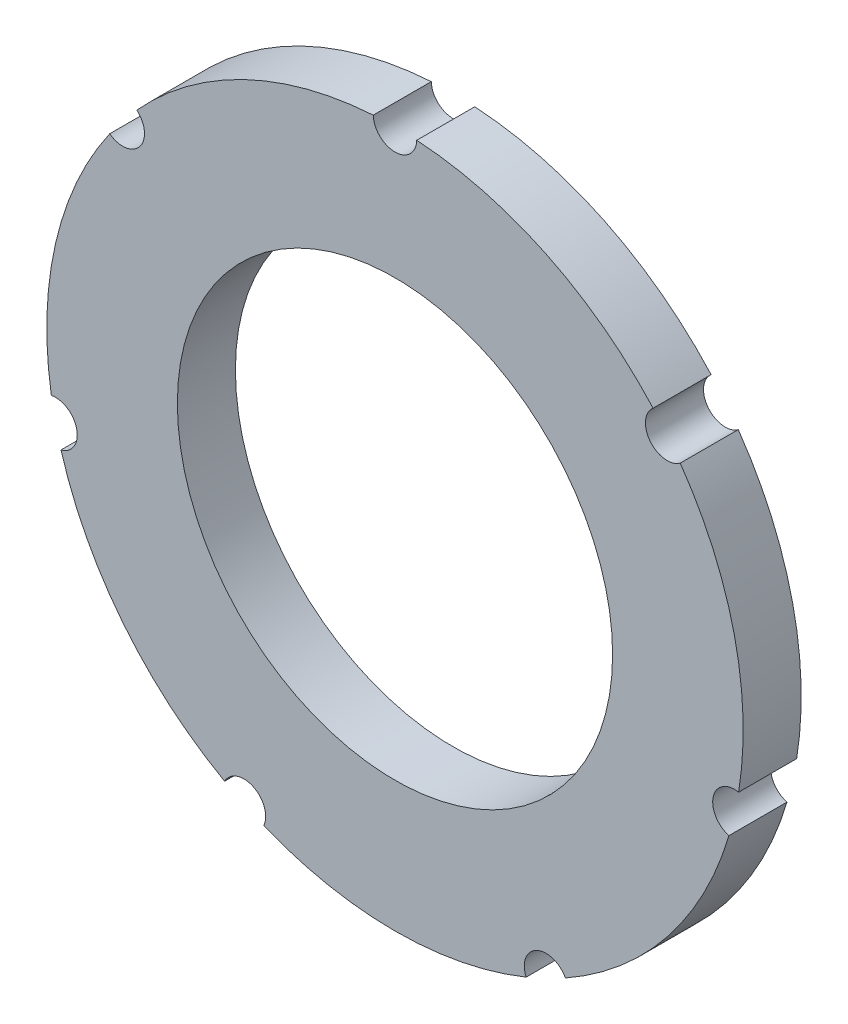
ISO-10303-21;
HEADER;
FILE_DESCRIPTION(('STEP AP214'),'2;1');
FILE_NAME('part.step','',(''),(''),'','','');
FILE_SCHEMA(('AUTOMOTIVE_DESIGN { 1 0 10303 214 1 1 1 1 }'));
ENDSEC;
DATA;
#1=APPLICATION_CONTEXT('core data for automotive mechanical design processes');
#2=APPLICATION_PROTOCOL_DEFINITION('international standard','automotive_design',2000,#1);
#3=PRODUCT_CONTEXT('',#1,'mechanical');
#4=PRODUCT('Part','Part','',(#3));
#5=PRODUCT_RELATED_PRODUCT_CATEGORY('part','',(#4));
#6=PRODUCT_DEFINITION_FORMATION('','',#4);
#7=PRODUCT_DEFINITION_CONTEXT('part definition',#1,'design');
#8=PRODUCT_DEFINITION('design','',#6,#7);
#9=PRODUCT_DEFINITION_SHAPE('','',#8);
#10=(LENGTH_UNIT() NAMED_UNIT(*) SI_UNIT(.MILLI.,.METRE.));
#11=(NAMED_UNIT(*) PLANE_ANGLE_UNIT() SI_UNIT($,.RADIAN.));
#12=(NAMED_UNIT(*) SI_UNIT($,.STERADIAN.) SOLID_ANGLE_UNIT());
#13=UNCERTAINTY_MEASURE_WITH_UNIT(LENGTH_MEASURE(1.E-05),#10,'distance_accuracy_value','');
#14=(GEOMETRIC_REPRESENTATION_CONTEXT(3) GLOBAL_UNCERTAINTY_ASSIGNED_CONTEXT((#13)) GLOBAL_UNIT_ASSIGNED_CONTEXT((#10,
#11,#12)) REPRESENTATION_CONTEXT('',''));
#15=CARTESIAN_POINT('',(0.,0.,0.));
#16=DIRECTION('',(0.,0.,1.));
#17=DIRECTION('',(1.,0.,0.));
#18=AXIS2_PLACEMENT_3D('',#15,#16,#17);
#19=CARTESIAN_POINT('',(0.,12.,4.));
#20=DIRECTION('',(0.,0.,1.));
#21=DIRECTION('',(1.,0.,0.));
#22=AXIS2_PLACEMENT_3D('',#19,#20,#21);
#23=PLANE('',#22);
#24=CARTESIAN_POINT('',(0.,0.,4.));
#25=DIRECTION('',(0.,0.,1.));
#26=DIRECTION('',(1.,0.,0.));
#27=AXIS2_PLACEMENT_3D('',#24,#25,#26);
#28=CIRCLE('',#27,24.);
#29=CARTESIAN_POINT('',(17.7925292948168,16.1067036134985,4.));
#30=VERTEX_POINT('',#29);
#31=CARTESIAN_POINT('',(1.4992673992237,23.953125,4.));
#32=VERTEX_POINT('',#31);
#33=EDGE_CURVE('E197',#30,#32,#28,.T.);
#34=ORIENTED_EDGE('',*,*,#33,.T.);
#35=CARTESIAN_POINT('',(0.,24.,4.));
#36=DIRECTION('',(0.,0.,-1.));
#37=DIRECTION('',(1.,0.,0.));
#38=AXIS2_PLACEMENT_3D('',#35,#36,#37);
#39=CIRCLE('',#38,1.5);
#40=CARTESIAN_POINT('',(-1.4992673992237,23.953125,4.));
#41=VERTEX_POINT('',#40);
#42=EDGE_CURVE('E115',#32,#41,#39,.T.);
#43=ORIENTED_EDGE('',*,*,#42,.T.);
#44=CARTESIAN_POINT('',(0.,0.,4.));
#45=DIRECTION('',(0.,0.,1.));
#46=DIRECTION('',(1.,0.,0.));
#47=AXIS2_PLACEMENT_3D('',#44,#45,#46);
#48=CIRCLE('',#47,24.);
#49=CARTESIAN_POINT('',(-17.7925292948168,16.1067036134985,4.));
#50=VERTEX_POINT('',#49);
#51=EDGE_CURVE('E230',#41,#50,#48,.T.);
#52=ORIENTED_EDGE('',*,*,#51,.T.);
#53=CARTESIAN_POINT('',(-18.7639555792327,14.9637552446096,4.));
#54=DIRECTION('',(0.,0.,-1.));
#55=DIRECTION('',(1.,0.,0.));
#56=AXIS2_PLACEMENT_3D('',#53,#54,#55);
#57=CIRCLE('',#56,1.5);
#58=CARTESIAN_POINT('',(-19.6620851621673,13.7623547067964,4.));
#59=VERTEX_POINT('',#58);
#60=EDGE_CURVE('E249',#50,#59,#57,.T.);
#61=ORIENTED_EDGE('',*,*,#60,.T.);
#62=CARTESIAN_POINT('',(0.,0.,4.));
#63=DIRECTION('',(0.,0.,1.));
#64=DIRECTION('',(1.,0.,0.));
#65=AXIS2_PLACEMENT_3D('',#62,#63,#64);
#66=CIRCLE('',#65,24.);
#67=CARTESIAN_POINT('',(-23.6861885284058,-3.8683941108449,4.));
#68=VERTEX_POINT('',#67);
#69=EDGE_CURVE('E246',#59,#68,#66,.T.);
#70=ORIENTED_EDGE('',*,*,#69,.T.);
#71=CARTESIAN_POINT('',(-23.3982698923638,-5.34050241495155,4.));
#72=DIRECTION('',(0.,0.,-1.));
#73=DIRECTION('',(1.,0.,0.));
#74=AXIS2_PLACEMENT_3D('',#71,#72,#73);
#75=CIRCLE('',#74,1.5);
#76=CARTESIAN_POINT('',(-23.0189517645547,-6.79174938149978,4.));
#77=VERTEX_POINT('',#76);
#78=EDGE_CURVE('E248',#68,#77,#75,.T.);
#79=ORIENTED_EDGE('',*,*,#78,.T.);
#80=CARTESIAN_POINT('',(0.,0.,4.));
#81=DIRECTION('',(0.,0.,1.));
#82=DIRECTION('',(1.,0.,0.));
#83=AXIS2_PLACEMENT_3D('',#80,#81,#82);
#84=CIRCLE('',#83,24.);
#85=CARTESIAN_POINT('',(-11.7436646899119,-20.9305121688629,4.));
#86=VERTEX_POINT('',#85);
#87=EDGE_CURVE('E251',#77,#86,#84,.T.);
#88=ORIENTED_EDGE('',*,*,#87,.T.);
#89=CARTESIAN_POINT('',(-10.4132097388214,-21.6232528296581,4.));
#90=DIRECTION('',(0.,0.,-1.));
#91=DIRECTION('',(1.,0.,0.));
#92=AXIS2_PLACEMENT_3D('',#89,#90,#91);
#93=CIRCLE('',#92,1.5);
#94=CARTESIAN_POINT('',(-9.04207818718867,-22.2315276590874,4.));
#95=VERTEX_POINT('',#94);
#96=EDGE_CURVE('E257',#86,#95,#93,.T.);
#97=ORIENTED_EDGE('',*,*,#96,.T.);
#98=CARTESIAN_POINT('',(0.,0.,4.));
#99=DIRECTION('',(0.,0.,1.));
#100=DIRECTION('',(1.,0.,0.));
#101=AXIS2_PLACEMENT_3D('',#98,#99,#100);
#102=CIRCLE('',#101,24.);
#103=CARTESIAN_POINT('',(9.04207818718866,-22.2315276590874,4.));
#104=VERTEX_POINT('',#103);
#105=EDGE_CURVE('E259',#95,#104,#102,.T.);
#106=ORIENTED_EDGE('',*,*,#105,.T.);
#107=CARTESIAN_POINT('',(10.4132097388214,-21.6232528296581,4.));
#108=DIRECTION('',(0.,0.,-1.));
#109=DIRECTION('',(1.,0.,0.));
#110=AXIS2_PLACEMENT_3D('',#107,#108,#109);
#111=CIRCLE('',#110,1.50000000000001);
#112=CARTESIAN_POINT('',(11.7436646899118,-20.9305121688629,4.));
#113=VERTEX_POINT('',#112);
#114=EDGE_CURVE('E261',#104,#113,#111,.T.);
#115=ORIENTED_EDGE('',*,*,#114,.T.);
#116=CARTESIAN_POINT('',(0.,0.,4.));
#117=DIRECTION('',(0.,0.,1.));
#118=DIRECTION('',(1.,0.,0.));
#119=AXIS2_PLACEMENT_3D('',#116,#117,#118);
#120=CIRCLE('',#119,24.);
#121=CARTESIAN_POINT('',(23.0189517645547,-6.79174938149978,4.));
#122=VERTEX_POINT('',#121);
#123=EDGE_CURVE('E152',#113,#122,#120,.T.);
#124=ORIENTED_EDGE('',*,*,#123,.T.);
#125=CARTESIAN_POINT('',(23.3982698923638,-5.34050241495154,4.));
#126=DIRECTION('',(0.,0.,-1.));
#127=DIRECTION('',(1.,0.,0.));
#128=AXIS2_PLACEMENT_3D('',#125,#126,#127);
#129=CIRCLE('',#128,1.5);
#130=CARTESIAN_POINT('',(23.6861885284058,-3.86839411084491,4.));
#131=VERTEX_POINT('',#130);
#132=EDGE_CURVE('E146',#122,#131,#129,.T.);
#133=ORIENTED_EDGE('',*,*,#132,.T.);
#134=CARTESIAN_POINT('',(0.,0.,4.));
#135=DIRECTION('',(0.,0.,1.));
#136=DIRECTION('',(1.,0.,0.));
#137=AXIS2_PLACEMENT_3D('',#134,#135,#136);
#138=CIRCLE('',#137,24.);
#139=CARTESIAN_POINT('',(19.6620851621673,13.7623547067964,4.));
#140=VERTEX_POINT('',#139);
#141=EDGE_CURVE('E150',#131,#140,#138,.T.);
#142=ORIENTED_EDGE('',*,*,#141,.T.);
#143=CARTESIAN_POINT('',(18.7639555792327,14.9637552446096,4.));
#144=DIRECTION('',(0.,0.,-1.));
#145=DIRECTION('',(1.,0.,0.));
#146=AXIS2_PLACEMENT_3D('',#143,#144,#145);
#147=CIRCLE('',#146,1.5);
#148=EDGE_CURVE('E54',#140,#30,#147,.T.);
#149=ORIENTED_EDGE('',*,*,#148,.T.);
#150=EDGE_LOOP('',(#34,#43,#52,#61,#70,#79,#88,#97,#106,#115,#124,#133,#142,#149));
#151=FACE_BOUND('',#150,.T.);
#152=CARTESIAN_POINT('',(0.,0.,4.));
#153=DIRECTION('',(0.,0.,1.));
#154=DIRECTION('',(1.,0.,0.));
#155=AXIS2_PLACEMENT_3D('',#152,#153,#154);
#156=CIRCLE('',#155,15.);
#157=CARTESIAN_POINT('',(15.,0.,4.));
#158=VERTEX_POINT('',#157);
#159=EDGE_CURVE('E174',#158,#158,#156,.T.);
#160=ORIENTED_EDGE('',*,*,#159,.F.);
#161=EDGE_LOOP('',(#160));
#162=FACE_BOUND('',#161,.T.);
#163=ADVANCED_FACE('F37',(#151,#162),#23,.T.);
#164=CARTESIAN_POINT('',(0.,12.,0.));
#165=DIRECTION('',(0.,0.,1.));
#166=DIRECTION('',(1.,0.,0.));
#167=AXIS2_PLACEMENT_3D('',#164,#165,#166);
#168=PLANE('',#167);
#169=CARTESIAN_POINT('',(0.,0.,0.));
#170=DIRECTION('',(0.,0.,1.));
#171=DIRECTION('',(1.,0.,0.));
#172=AXIS2_PLACEMENT_3D('',#169,#170,#171);
#173=CIRCLE('',#172,24.);
#174=CARTESIAN_POINT('',(17.7925292948168,16.1067036134985,0.));
#175=VERTEX_POINT('',#174);
#176=CARTESIAN_POINT('',(1.4992673992237,23.953125,0.));
#177=VERTEX_POINT('',#176);
#178=EDGE_CURVE('E170',#175,#177,#173,.T.);
#179=ORIENTED_EDGE('',*,*,#178,.F.);
#180=CARTESIAN_POINT('',(18.7639555792327,14.9637552446096,0.));
#181=DIRECTION('',(0.,0.,-1.));
#182=DIRECTION('',(1.,0.,0.));
#183=AXIS2_PLACEMENT_3D('',#180,#181,#182);
#184=CIRCLE('',#183,1.5);
#185=CARTESIAN_POINT('',(19.6620851621673,13.7623547067964,0.));
#186=VERTEX_POINT('',#185);
#187=EDGE_CURVE('E107',#186,#175,#184,.T.);
#188=ORIENTED_EDGE('',*,*,#187,.F.);
#189=CARTESIAN_POINT('',(0.,0.,0.));
#190=DIRECTION('',(0.,0.,1.));
#191=DIRECTION('',(1.,0.,0.));
#192=AXIS2_PLACEMENT_3D('',#189,#190,#191);
#193=CIRCLE('',#192,24.);
#194=CARTESIAN_POINT('',(23.6861885284058,-3.86839411084491,0.));
#195=VERTEX_POINT('',#194);
#196=EDGE_CURVE('E101',#195,#186,#193,.T.);
#197=ORIENTED_EDGE('',*,*,#196,.F.);
#198=CARTESIAN_POINT('',(23.3982698923638,-5.34050241495154,0.));
#199=DIRECTION('',(0.,0.,-1.));
#200=DIRECTION('',(1.,0.,0.));
#201=AXIS2_PLACEMENT_3D('',#198,#199,#200);
#202=CIRCLE('',#201,1.5);
#203=CARTESIAN_POINT('',(23.0189517645547,-6.79174938149978,0.));
#204=VERTEX_POINT('',#203);
#205=EDGE_CURVE('E160',#204,#195,#202,.T.);
#206=ORIENTED_EDGE('',*,*,#205,.F.);
#207=CARTESIAN_POINT('',(0.,0.,0.));
#208=DIRECTION('',(0.,0.,1.));
#209=DIRECTION('',(1.,0.,0.));
#210=AXIS2_PLACEMENT_3D('',#207,#208,#209);
#211=CIRCLE('',#210,24.);
#212=CARTESIAN_POINT('',(11.7436646899118,-20.9305121688629,0.));
#213=VERTEX_POINT('',#212);
#214=EDGE_CURVE('E192',#213,#204,#211,.T.);
#215=ORIENTED_EDGE('',*,*,#214,.F.);
#216=CARTESIAN_POINT('',(10.4132097388214,-21.6232528296581,0.));
#217=DIRECTION('',(0.,0.,-1.));
#218=DIRECTION('',(1.,0.,0.));
#219=AXIS2_PLACEMENT_3D('',#216,#217,#218);
#220=CIRCLE('',#219,1.50000000000001);
#221=CARTESIAN_POINT('',(9.04207818718866,-22.2315276590874,0.));
#222=VERTEX_POINT('',#221);
#223=EDGE_CURVE('E190',#222,#213,#220,.T.);
#224=ORIENTED_EDGE('',*,*,#223,.F.);
#225=CARTESIAN_POINT('',(0.,0.,0.));
#226=DIRECTION('',(0.,0.,1.));
#227=DIRECTION('',(1.,0.,0.));
#228=AXIS2_PLACEMENT_3D('',#225,#226,#227);
#229=CIRCLE('',#228,24.);
#230=CARTESIAN_POINT('',(-9.04207818718867,-22.2315276590874,0.));
#231=VERTEX_POINT('',#230);
#232=EDGE_CURVE('E188',#231,#222,#229,.T.);
#233=ORIENTED_EDGE('',*,*,#232,.F.);
#234=CARTESIAN_POINT('',(-10.4132097388214,-21.6232528296581,0.));
#235=DIRECTION('',(0.,0.,-1.));
#236=DIRECTION('',(1.,0.,0.));
#237=AXIS2_PLACEMENT_3D('',#234,#235,#236);
#238=CIRCLE('',#237,1.5);
#239=CARTESIAN_POINT('',(-11.7436646899119,-20.9305121688629,0.));
#240=VERTEX_POINT('',#239);
#241=EDGE_CURVE('E186',#240,#231,#238,.T.);
#242=ORIENTED_EDGE('',*,*,#241,.F.);
#243=CARTESIAN_POINT('',(0.,0.,0.));
#244=DIRECTION('',(0.,0.,1.));
#245=DIRECTION('',(1.,0.,0.));
#246=AXIS2_PLACEMENT_3D('',#243,#244,#245);
#247=CIRCLE('',#246,24.);
#248=CARTESIAN_POINT('',(-23.0189517645547,-6.79174938149978,0.));
#249=VERTEX_POINT('',#248);
#250=EDGE_CURVE('E184',#249,#240,#247,.T.);
#251=ORIENTED_EDGE('',*,*,#250,.F.);
#252=CARTESIAN_POINT('',(-23.3982698923638,-5.34050241495155,0.));
#253=DIRECTION('',(0.,0.,-1.));
#254=DIRECTION('',(1.,0.,0.));
#255=AXIS2_PLACEMENT_3D('',#252,#253,#254);
#256=CIRCLE('',#255,1.5);
#257=CARTESIAN_POINT('',(-23.6861885284058,-3.8683941108449,0.));
#258=VERTEX_POINT('',#257);
#259=EDGE_CURVE('E182',#258,#249,#256,.T.);
#260=ORIENTED_EDGE('',*,*,#259,.F.);
#261=CARTESIAN_POINT('',(0.,0.,0.));
#262=DIRECTION('',(0.,0.,1.));
#263=DIRECTION('',(1.,0.,0.));
#264=AXIS2_PLACEMENT_3D('',#261,#262,#263);
#265=CIRCLE('',#264,24.);
#266=CARTESIAN_POINT('',(-19.6620851621673,13.7623547067964,0.));
#267=VERTEX_POINT('',#266);
#268=EDGE_CURVE('E180',#267,#258,#265,.T.);
#269=ORIENTED_EDGE('',*,*,#268,.F.);
#270=CARTESIAN_POINT('',(-18.7639555792327,14.9637552446096,0.));
#271=DIRECTION('',(0.,0.,-1.));
#272=DIRECTION('',(1.,0.,0.));
#273=AXIS2_PLACEMENT_3D('',#270,#271,#272);
#274=CIRCLE('',#273,1.5);
#275=CARTESIAN_POINT('',(-17.7925292948168,16.1067036134985,0.));
#276=VERTEX_POINT('',#275);
#277=EDGE_CURVE('E178',#276,#267,#274,.T.);
#278=ORIENTED_EDGE('',*,*,#277,.F.);
#279=CARTESIAN_POINT('',(0.,0.,0.));
#280=DIRECTION('',(0.,0.,1.));
#281=DIRECTION('',(1.,0.,0.));
#282=AXIS2_PLACEMENT_3D('',#279,#280,#281);
#283=CIRCLE('',#282,24.);
#284=CARTESIAN_POINT('',(-1.4992673992237,23.953125,0.));
#285=VERTEX_POINT('',#284);
#286=EDGE_CURVE('E176',#285,#276,#283,.T.);
#287=ORIENTED_EDGE('',*,*,#286,.F.);
#288=CARTESIAN_POINT('',(0.,24.,0.));
#289=DIRECTION('',(0.,0.,-1.));
#290=DIRECTION('',(1.,0.,0.));
#291=AXIS2_PLACEMENT_3D('',#288,#289,#290);
#292=CIRCLE('',#291,1.5);
#293=EDGE_CURVE('E173',#177,#285,#292,.T.);
#294=ORIENTED_EDGE('',*,*,#293,.F.);
#295=EDGE_LOOP('',(#179,#188,#197,#206,#215,#224,#233,#242,#251,#260,#269,#278,#287,#294));
#296=FACE_BOUND('',#295,.T.);
#297=CARTESIAN_POINT('',(0.,0.,0.));
#298=DIRECTION('',(0.,0.,1.));
#299=DIRECTION('',(1.,0.,0.));
#300=AXIS2_PLACEMENT_3D('',#297,#298,#299);
#301=CIRCLE('',#300,15.);
#302=CARTESIAN_POINT('',(15.,0.,0.));
#303=VERTEX_POINT('',#302);
#304=EDGE_CURVE('E440',#303,#303,#301,.T.);
#305=ORIENTED_EDGE('',*,*,#304,.T.);
#306=EDGE_LOOP('',(#305));
#307=FACE_BOUND('',#306,.T.);
#308=ADVANCED_FACE('F234',(#296,#307),#168,.F.);
#309=CARTESIAN_POINT('',(0.,0.,4.));
#310=DIRECTION('',(0.,0.,-1.));
#311=DIRECTION('',(-1.,0.,0.));
#312=AXIS2_PLACEMENT_3D('',#309,#310,#311);
#313=CYLINDRICAL_SURFACE('',#312,24.);
#314=ORIENTED_EDGE('',*,*,#178,.T.);
#315=DIRECTION('',(0.,0.,-1.));
#316=VECTOR('',#315,1.);
#317=CARTESIAN_POINT('',(1.4992673992237,23.953125,4.));
#318=LINE('',#317,#316);
#319=EDGE_CURVE('E11',#32,#177,#318,.T.);
#320=ORIENTED_EDGE('',*,*,#319,.F.);
#321=ORIENTED_EDGE('',*,*,#33,.F.);
#322=DIRECTION('',(0.,0.,-1.));
#323=VECTOR('',#322,1.);
#324=CARTESIAN_POINT('',(17.7925292948168,16.1067036134985,4.));
#325=LINE('',#324,#323);
#326=EDGE_CURVE('E166',#30,#175,#325,.T.);
#327=ORIENTED_EDGE('',*,*,#326,.T.);
#328=EDGE_LOOP('',(#314,#320,#321,#327));
#329=FACE_BOUND('',#328,.T.);
#330=ADVANCED_FACE('F39',(#329),#313,.T.);
#331=CARTESIAN_POINT('',(0.,24.,4.));
#332=DIRECTION('',(0.,0.,-1.));
#333=DIRECTION('',(-1.,0.,0.));
#334=AXIS2_PLACEMENT_3D('',#331,#332,#333);
#335=CYLINDRICAL_SURFACE('',#334,1.5);
#336=ORIENTED_EDGE('',*,*,#293,.T.);
#337=DIRECTION('',(0.,0.,-1.));
#338=VECTOR('',#337,1.);
#339=CARTESIAN_POINT('',(-1.4992673992237,23.953125,4.));
#340=LINE('',#339,#338);
#341=EDGE_CURVE('E46',#41,#285,#340,.T.);
#342=ORIENTED_EDGE('',*,*,#341,.F.);
#343=ORIENTED_EDGE('',*,*,#42,.F.);
#344=ORIENTED_EDGE('',*,*,#319,.T.);
#345=EDGE_LOOP('',(#336,#342,#343,#344));
#346=FACE_BOUND('',#345,.T.);
#347=ADVANCED_FACE('F295',(#346),#335,.F.);
#348=CARTESIAN_POINT('',(0.,0.,4.));
#349=DIRECTION('',(0.,0.,-1.));
#350=DIRECTION('',(-1.,0.,0.));
#351=AXIS2_PLACEMENT_3D('',#348,#349,#350);
#352=CYLINDRICAL_SURFACE('',#351,24.);
#353=ORIENTED_EDGE('',*,*,#286,.T.);
#354=DIRECTION('',(0.,0.,-1.));
#355=VECTOR('',#354,1.);
#356=CARTESIAN_POINT('',(-17.7925292948168,16.1067036134985,4.));
#357=LINE('',#356,#355);
#358=EDGE_CURVE('E222',#50,#276,#357,.T.);
#359=ORIENTED_EDGE('',*,*,#358,.F.);
#360=ORIENTED_EDGE('',*,*,#51,.F.);
#361=ORIENTED_EDGE('',*,*,#341,.T.);
#362=EDGE_LOOP('',(#353,#359,#360,#361));
#363=FACE_BOUND('',#362,.T.);
#364=ADVANCED_FACE('F228',(#363),#352,.T.);
#365=CARTESIAN_POINT('',(-18.7639555792327,14.9637552446096,4.));
#366=DIRECTION('',(0.,0.,-1.));
#367=DIRECTION('',(-1.,0.,0.));
#368=AXIS2_PLACEMENT_3D('',#365,#366,#367);
#369=CYLINDRICAL_SURFACE('',#368,1.5);
#370=ORIENTED_EDGE('',*,*,#277,.T.);
#371=DIRECTION('',(0.,0.,-1.));
#372=VECTOR('',#371,1.);
#373=CARTESIAN_POINT('',(-19.6620851621673,13.7623547067964,4.));
#374=LINE('',#373,#372);
#375=EDGE_CURVE('E219',#59,#267,#374,.T.);
#376=ORIENTED_EDGE('',*,*,#375,.F.);
#377=ORIENTED_EDGE('',*,*,#60,.F.);
#378=ORIENTED_EDGE('',*,*,#358,.T.);
#379=EDGE_LOOP('',(#370,#376,#377,#378));
#380=FACE_BOUND('',#379,.T.);
#381=ADVANCED_FACE('F240',(#380),#369,.F.);
#382=CARTESIAN_POINT('',(0.,0.,4.));
#383=DIRECTION('',(0.,0.,-1.));
#384=DIRECTION('',(-1.,0.,0.));
#385=AXIS2_PLACEMENT_3D('',#382,#383,#384);
#386=CYLINDRICAL_SURFACE('',#385,24.);
#387=ORIENTED_EDGE('',*,*,#268,.T.);
#388=DIRECTION('',(0.,0.,-1.));
#389=VECTOR('',#388,1.);
#390=CARTESIAN_POINT('',(-23.6861885284058,-3.8683941108449,4.));
#391=LINE('',#390,#389);
#392=EDGE_CURVE('E216',#68,#258,#391,.T.);
#393=ORIENTED_EDGE('',*,*,#392,.F.);
#394=ORIENTED_EDGE('',*,*,#69,.F.);
#395=ORIENTED_EDGE('',*,*,#375,.T.);
#396=EDGE_LOOP('',(#387,#393,#394,#395));
#397=FACE_BOUND('',#396,.T.);
#398=ADVANCED_FACE('F244',(#397),#386,.T.);
#399=CARTESIAN_POINT('',(-23.3982698923638,-5.34050241495155,4.));
#400=DIRECTION('',(0.,0.,-1.));
#401=DIRECTION('',(-1.,0.,0.));
#402=AXIS2_PLACEMENT_3D('',#399,#400,#401);
#403=CYLINDRICAL_SURFACE('',#402,1.5);
#404=ORIENTED_EDGE('',*,*,#259,.T.);
#405=DIRECTION('',(0.,0.,-1.));
#406=VECTOR('',#405,1.);
#407=CARTESIAN_POINT('',(-23.0189517645547,-6.79174938149978,4.));
#408=LINE('',#407,#406);
#409=EDGE_CURVE('E213',#77,#249,#408,.T.);
#410=ORIENTED_EDGE('',*,*,#409,.F.);
#411=ORIENTED_EDGE('',*,*,#78,.F.);
#412=ORIENTED_EDGE('',*,*,#392,.T.);
#413=EDGE_LOOP('',(#404,#410,#411,#412));
#414=FACE_BOUND('',#413,.T.);
#415=ADVANCED_FACE('F308',(#414),#403,.F.);
#416=CARTESIAN_POINT('',(0.,0.,4.));
#417=DIRECTION('',(0.,0.,-1.));
#418=DIRECTION('',(-1.,0.,0.));
#419=AXIS2_PLACEMENT_3D('',#416,#417,#418);
#420=CYLINDRICAL_SURFACE('',#419,24.);
#421=ORIENTED_EDGE('',*,*,#250,.T.);
#422=DIRECTION('',(0.,0.,-1.));
#423=VECTOR('',#422,1.);
#424=CARTESIAN_POINT('',(-11.7436646899119,-20.9305121688629,4.));
#425=LINE('',#424,#423);
#426=EDGE_CURVE('E210',#86,#240,#425,.T.);
#427=ORIENTED_EDGE('',*,*,#426,.F.);
#428=ORIENTED_EDGE('',*,*,#87,.F.);
#429=ORIENTED_EDGE('',*,*,#409,.T.);
#430=EDGE_LOOP('',(#421,#427,#428,#429));
#431=FACE_BOUND('',#430,.T.);
#432=ADVANCED_FACE('F311',(#431),#420,.T.);
#433=CARTESIAN_POINT('',(-10.4132097388214,-21.6232528296581,4.));
#434=DIRECTION('',(0.,0.,-1.));
#435=DIRECTION('',(-1.,0.,0.));
#436=AXIS2_PLACEMENT_3D('',#433,#434,#435);
#437=CYLINDRICAL_SURFACE('',#436,1.5);
#438=ORIENTED_EDGE('',*,*,#241,.T.);
#439=DIRECTION('',(0.,0.,-1.));
#440=VECTOR('',#439,1.);
#441=CARTESIAN_POINT('',(-9.04207818718867,-22.2315276590874,4.));
#442=LINE('',#441,#440);
#443=EDGE_CURVE('E207',#95,#231,#442,.T.);
#444=ORIENTED_EDGE('',*,*,#443,.F.);
#445=ORIENTED_EDGE('',*,*,#96,.F.);
#446=ORIENTED_EDGE('',*,*,#426,.T.);
#447=EDGE_LOOP('',(#438,#444,#445,#446));
#448=FACE_BOUND('',#447,.T.);
#449=ADVANCED_FACE('F315',(#448),#437,.F.);
#450=CARTESIAN_POINT('',(0.,0.,4.));
#451=DIRECTION('',(0.,0.,-1.));
#452=DIRECTION('',(-1.,0.,0.));
#453=AXIS2_PLACEMENT_3D('',#450,#451,#452);
#454=CYLINDRICAL_SURFACE('',#453,24.);
#455=ORIENTED_EDGE('',*,*,#232,.T.);
#456=DIRECTION('',(0.,0.,-1.));
#457=VECTOR('',#456,1.);
#458=CARTESIAN_POINT('',(9.04207818718866,-22.2315276590874,4.));
#459=LINE('',#458,#457);
#460=EDGE_CURVE('E204',#104,#222,#459,.T.);
#461=ORIENTED_EDGE('',*,*,#460,.F.);
#462=ORIENTED_EDGE('',*,*,#105,.F.);
#463=ORIENTED_EDGE('',*,*,#443,.T.);
#464=EDGE_LOOP('',(#455,#461,#462,#463));
#465=FACE_BOUND('',#464,.T.);
#466=ADVANCED_FACE('F319',(#465),#454,.T.);
#467=CARTESIAN_POINT('',(10.4132097388214,-21.6232528296581,4.));
#468=DIRECTION('',(0.,0.,-1.));
#469=DIRECTION('',(-1.,0.,0.));
#470=AXIS2_PLACEMENT_3D('',#467,#468,#469);
#471=CYLINDRICAL_SURFACE('',#470,1.50000000000001);
#472=ORIENTED_EDGE('',*,*,#223,.T.);
#473=DIRECTION('',(0.,0.,-1.));
#474=VECTOR('',#473,1.);
#475=CARTESIAN_POINT('',(11.7436646899118,-20.9305121688629,4.));
#476=LINE('',#475,#474);
#477=EDGE_CURVE('E201',#113,#213,#476,.T.);
#478=ORIENTED_EDGE('',*,*,#477,.F.);
#479=ORIENTED_EDGE('',*,*,#114,.F.);
#480=ORIENTED_EDGE('',*,*,#460,.T.);
#481=EDGE_LOOP('',(#472,#478,#479,#480));
#482=FACE_BOUND('',#481,.T.);
#483=ADVANCED_FACE('F267',(#482),#471,.F.);
#484=CARTESIAN_POINT('',(0.,0.,4.));
#485=DIRECTION('',(0.,0.,-1.));
#486=DIRECTION('',(-1.,0.,0.));
#487=AXIS2_PLACEMENT_3D('',#484,#485,#486);
#488=CYLINDRICAL_SURFACE('',#487,24.);
#489=ORIENTED_EDGE('',*,*,#214,.T.);
#490=DIRECTION('',(0.,0.,-1.));
#491=VECTOR('',#490,1.);
#492=CARTESIAN_POINT('',(23.0189517645547,-6.79174938149978,4.));
#493=LINE('',#492,#491);
#494=EDGE_CURVE('E161',#122,#204,#493,.T.);
#495=ORIENTED_EDGE('',*,*,#494,.F.);
#496=ORIENTED_EDGE('',*,*,#123,.F.);
#497=ORIENTED_EDGE('',*,*,#477,.T.);
#498=EDGE_LOOP('',(#489,#495,#496,#497));
#499=FACE_BOUND('',#498,.T.);
#500=ADVANCED_FACE('F271',(#499),#488,.T.);
#501=CARTESIAN_POINT('',(23.3982698923638,-5.34050241495154,4.));
#502=DIRECTION('',(0.,0.,-1.));
#503=DIRECTION('',(-1.,0.,0.));
#504=AXIS2_PLACEMENT_3D('',#501,#502,#503);
#505=CYLINDRICAL_SURFACE('',#504,1.5);
#506=ORIENTED_EDGE('',*,*,#205,.T.);
#507=DIRECTION('',(0.,0.,-1.));
#508=VECTOR('',#507,1.);
#509=CARTESIAN_POINT('',(23.6861885284058,-3.86839411084491,4.));
#510=LINE('',#509,#508);
#511=EDGE_CURVE('E157',#131,#195,#510,.T.);
#512=ORIENTED_EDGE('',*,*,#511,.F.);
#513=ORIENTED_EDGE('',*,*,#132,.F.);
#514=ORIENTED_EDGE('',*,*,#494,.T.);
#515=EDGE_LOOP('',(#506,#512,#513,#514));
#516=FACE_BOUND('',#515,.T.);
#517=ADVANCED_FACE('F158',(#516),#505,.F.);
#518=CARTESIAN_POINT('',(0.,0.,4.));
#519=DIRECTION('',(0.,0.,-1.));
#520=DIRECTION('',(-1.,0.,0.));
#521=AXIS2_PLACEMENT_3D('',#518,#519,#520);
#522=CYLINDRICAL_SURFACE('',#521,24.);
#523=ORIENTED_EDGE('',*,*,#196,.T.);
#524=DIRECTION('',(0.,0.,-1.));
#525=VECTOR('',#524,1.);
#526=CARTESIAN_POINT('',(19.6620851621673,13.7623547067964,4.));
#527=LINE('',#526,#525);
#528=EDGE_CURVE('E162',#140,#186,#527,.T.);
#529=ORIENTED_EDGE('',*,*,#528,.F.);
#530=ORIENTED_EDGE('',*,*,#141,.F.);
#531=ORIENTED_EDGE('',*,*,#511,.T.);
#532=EDGE_LOOP('',(#523,#529,#530,#531));
#533=FACE_BOUND('',#532,.T.);
#534=ADVANCED_FACE('F164',(#533),#522,.T.);
#535=CARTESIAN_POINT('',(18.7639555792327,14.9637552446096,4.));
#536=DIRECTION('',(0.,0.,-1.));
#537=DIRECTION('',(-1.,0.,0.));
#538=AXIS2_PLACEMENT_3D('',#535,#536,#537);
#539=CYLINDRICAL_SURFACE('',#538,1.5);
#540=ORIENTED_EDGE('',*,*,#187,.T.);
#541=ORIENTED_EDGE('',*,*,#326,.F.);
#542=ORIENTED_EDGE('',*,*,#148,.F.);
#543=ORIENTED_EDGE('',*,*,#528,.T.);
#544=EDGE_LOOP('',(#540,#541,#542,#543));
#545=FACE_BOUND('',#544,.T.);
#546=ADVANCED_FACE('F275',(#545),#539,.F.);
#547=CARTESIAN_POINT('',(0.,0.,4.));
#548=DIRECTION('',(0.,0.,-1.));
#549=DIRECTION('',(-1.,0.,0.));
#550=AXIS2_PLACEMENT_3D('',#547,#548,#549);
#551=CYLINDRICAL_SURFACE('',#550,15.);
#552=ORIENTED_EDGE('',*,*,#159,.T.);
#553=EDGE_LOOP('',(#552));
#554=FACE_BOUND('',#553,.T.);
#555=ORIENTED_EDGE('',*,*,#304,.F.);
#556=EDGE_LOOP('',(#555));
#557=FACE_BOUND('',#556,.T.);
#558=ADVANCED_FACE('F277',(#554,#557),#551,.F.);
#559=CLOSED_SHELL('',(#163,#308,#330,#347,#364,#381,#398,#415,#432,#449,#466,#483,#500,#517,
#534,#546,#558));
#560=MANIFOLD_SOLID_BREP('B2',#559);
#561=ADVANCED_BREP_SHAPE_REPRESENTATION('',(#18,#560),#14);
#562=SHAPE_DEFINITION_REPRESENTATION(#9,#561);
ENDSEC;
END-ISO-10303-21;
